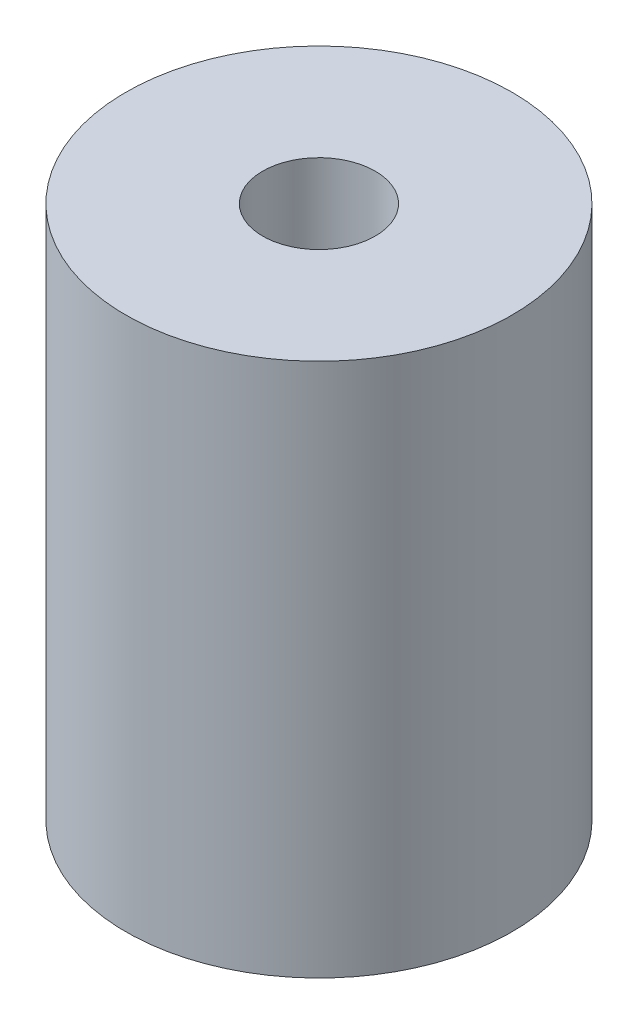
ISO-10303-21;
HEADER;
FILE_DESCRIPTION(('STEP AP214'),'2;1');
FILE_NAME('part.step','',(''),(''),'','','');
FILE_SCHEMA(('AUTOMOTIVE_DESIGN { 1 0 10303 214 1 1 1 1 }'));
ENDSEC;
DATA;
#1=APPLICATION_CONTEXT('core data for automotive mechanical design processes');
#2=APPLICATION_PROTOCOL_DEFINITION('international standard','automotive_design',2000,#1);
#3=PRODUCT_CONTEXT('',#1,'mechanical');
#4=PRODUCT('Part','Part','',(#3));
#5=PRODUCT_RELATED_PRODUCT_CATEGORY('part','',(#4));
#6=PRODUCT_DEFINITION_FORMATION('','',#4);
#7=PRODUCT_DEFINITION_CONTEXT('part definition',#1,'design');
#8=PRODUCT_DEFINITION('design','',#6,#7);
#9=PRODUCT_DEFINITION_SHAPE('','',#8);
#10=(LENGTH_UNIT() NAMED_UNIT(*) SI_UNIT(.MILLI.,.METRE.));
#11=(NAMED_UNIT(*) PLANE_ANGLE_UNIT() SI_UNIT($,.RADIAN.));
#12=(NAMED_UNIT(*) SI_UNIT($,.STERADIAN.) SOLID_ANGLE_UNIT());
#13=UNCERTAINTY_MEASURE_WITH_UNIT(LENGTH_MEASURE(1.E-05),#10,'distance_accuracy_value','');
#14=(GEOMETRIC_REPRESENTATION_CONTEXT(3) GLOBAL_UNCERTAINTY_ASSIGNED_CONTEXT((#13)) GLOBAL_UNIT_ASSIGNED_CONTEXT((#10,
#11,#12)) REPRESENTATION_CONTEXT('',''));
#15=CARTESIAN_POINT('',(0.,0.,0.));
#16=DIRECTION('',(0.,0.,1.));
#17=DIRECTION('',(1.,0.,0.));
#18=AXIS2_PLACEMENT_3D('',#15,#16,#17);
#19=CARTESIAN_POINT('',(0.,8.3,0.));
#20=DIRECTION('',(0.,1.,0.));
#21=DIRECTION('',(0.,0.,1.));
#22=AXIS2_PLACEMENT_3D('',#19,#20,#21);
#23=PLANE('',#22);
#24=CARTESIAN_POINT('',(0.,8.3,0.));
#25=DIRECTION('',(0.,1.,0.));
#26=DIRECTION('',(0.,0.,1.));
#27=AXIS2_PLACEMENT_3D('',#24,#25,#26);
#28=CIRCLE('',#27,6.);
#29=CARTESIAN_POINT('',(0.,8.3,-6.));
#30=VERTEX_POINT('',#29);
#31=EDGE_CURVE('E10',#30,#30,#28,.T.);
#32=ORIENTED_EDGE('',*,*,#31,.T.);
#33=EDGE_LOOP('',(#32));
#34=FACE_BOUND('',#33,.T.);
#35=CARTESIAN_POINT('',(0.,8.3,0.));
#36=DIRECTION('',(0.,1.,0.));
#37=DIRECTION('',(0.,0.,1.));
#38=AXIS2_PLACEMENT_3D('',#35,#36,#37);
#39=CIRCLE('',#38,1.75);
#40=CARTESIAN_POINT('',(0.,8.3,-1.75));
#41=VERTEX_POINT('',#40);
#42=EDGE_CURVE('E56',#41,#41,#39,.T.);
#43=ORIENTED_EDGE('',*,*,#42,.F.);
#44=EDGE_LOOP('',(#43));
#45=FACE_BOUND('',#44,.T.);
#46=ADVANCED_FACE('F45',(#34,#45),#23,.T.);
#47=CARTESIAN_POINT('',(0.,-8.3,0.));
#48=DIRECTION('',(0.,1.,0.));
#49=DIRECTION('',(0.,0.,1.));
#50=AXIS2_PLACEMENT_3D('',#47,#48,#49);
#51=PLANE('',#50);
#52=CARTESIAN_POINT('',(0.,-8.3,0.));
#53=DIRECTION('',(0.,1.,0.));
#54=DIRECTION('',(0.,0.,1.));
#55=AXIS2_PLACEMENT_3D('',#52,#53,#54);
#56=CIRCLE('',#55,6.);
#57=CARTESIAN_POINT('',(0.,-8.3,-6.));
#58=VERTEX_POINT('',#57);
#59=EDGE_CURVE('E49',#58,#58,#56,.T.);
#60=ORIENTED_EDGE('',*,*,#59,.F.);
#61=EDGE_LOOP('',(#60));
#62=FACE_BOUND('',#61,.T.);
#63=CARTESIAN_POINT('',(0.,-8.3,0.));
#64=DIRECTION('',(0.,1.,0.));
#65=DIRECTION('',(0.,0.,1.));
#66=AXIS2_PLACEMENT_3D('',#63,#64,#65);
#67=CIRCLE('',#66,1.75);
#68=CARTESIAN_POINT('',(0.,-8.3,-1.75));
#69=VERTEX_POINT('',#68);
#70=EDGE_CURVE('E58',#69,#69,#67,.T.);
#71=ORIENTED_EDGE('',*,*,#70,.T.);
#72=EDGE_LOOP('',(#71));
#73=FACE_BOUND('',#72,.T.);
#74=ADVANCED_FACE('F68',(#62,#73),#51,.F.);
#75=CARTESIAN_POINT('',(0.,8.3,0.));
#76=DIRECTION('',(0.,-1.,0.));
#77=DIRECTION('',(0.,0.,-1.));
#78=AXIS2_PLACEMENT_3D('',#75,#76,#77);
#79=CYLINDRICAL_SURFACE('',#78,6.);
#80=CARTESIAN_POINT('',(0.,8.3,-6.));
#81=CARTESIAN_POINT('',(0.,8.12708333333333,-6.));
#82=CARTESIAN_POINT('',(0.,7.95416666666667,-6.));
#83=CARTESIAN_POINT('',(0.,7.60833333333333,-6.));
#84=CARTESIAN_POINT('',(0.,7.43541666666667,-6.));
#85=CARTESIAN_POINT('',(0.,7.08958333333333,-6.));
#86=CARTESIAN_POINT('',(0.,6.91666666666667,-6.));
#87=CARTESIAN_POINT('',(0.,6.57083333333333,-6.));
#88=CARTESIAN_POINT('',(0.,6.39791666666667,-6.));
#89=CARTESIAN_POINT('',(0.,6.05208333333333,-6.));
#90=CARTESIAN_POINT('',(0.,5.87916666666667,-6.));
#91=CARTESIAN_POINT('',(0.,5.53333333333333,-6.));
#92=CARTESIAN_POINT('',(0.,5.36041666666667,-6.));
#93=CARTESIAN_POINT('',(0.,5.01458333333333,-6.));
#94=CARTESIAN_POINT('',(0.,4.84166666666667,-6.));
#95=CARTESIAN_POINT('',(0.,4.49583333333333,-6.));
#96=CARTESIAN_POINT('',(0.,4.32291666666667,-6.));
#97=CARTESIAN_POINT('',(0.,3.97708333333333,-6.));
#98=CARTESIAN_POINT('',(0.,3.80416666666667,-6.));
#99=CARTESIAN_POINT('',(0.,3.45833333333333,-6.));
#100=CARTESIAN_POINT('',(0.,3.28541666666667,-6.));
#101=CARTESIAN_POINT('',(0.,2.93958333333333,-6.));
#102=CARTESIAN_POINT('',(0.,2.76666666666667,-6.));
#103=CARTESIAN_POINT('',(0.,2.42083333333333,-6.));
#104=CARTESIAN_POINT('',(0.,2.24791666666667,-6.));
#105=CARTESIAN_POINT('',(0.,1.90208333333333,-6.));
#106=CARTESIAN_POINT('',(0.,1.72916666666667,-6.));
#107=CARTESIAN_POINT('',(0.,1.38333333333333,-6.));
#108=CARTESIAN_POINT('',(0.,1.21041666666667,-6.));
#109=CARTESIAN_POINT('',(0.,0.864583333333332,-6.));
#110=CARTESIAN_POINT('',(0.,0.691666666666665,-6.));
#111=CARTESIAN_POINT('',(0.,0.345833333333332,-6.));
#112=CARTESIAN_POINT('',(0.,0.172916666666666,-6.));
#113=CARTESIAN_POINT('',(0.,-0.172916666666667,-6.));
#114=CARTESIAN_POINT('',(0.,-0.345833333333333,-6.));
#115=CARTESIAN_POINT('',(0.,-0.691666666666667,-6.));
#116=CARTESIAN_POINT('',(0.,-0.864583333333333,-6.));
#117=CARTESIAN_POINT('',(0.,-1.21041666666667,-6.));
#118=CARTESIAN_POINT('',(0.,-1.38333333333333,-6.));
#119=CARTESIAN_POINT('',(0.,-1.72916666666667,-6.));
#120=CARTESIAN_POINT('',(0.,-1.90208333333333,-6.));
#121=CARTESIAN_POINT('',(0.,-2.24791666666667,-6.));
#122=CARTESIAN_POINT('',(0.,-2.42083333333333,-6.));
#123=CARTESIAN_POINT('',(0.,-2.76666666666667,-6.));
#124=CARTESIAN_POINT('',(0.,-2.93958333333333,-6.));
#125=CARTESIAN_POINT('',(0.,-3.28541666666667,-6.));
#126=CARTESIAN_POINT('',(0.,-3.45833333333333,-6.));
#127=CARTESIAN_POINT('',(0.,-3.80416666666667,-6.));
#128=CARTESIAN_POINT('',(0.,-3.97708333333333,-6.));
#129=CARTESIAN_POINT('',(0.,-4.32291666666667,-6.));
#130=CARTESIAN_POINT('',(0.,-4.49583333333333,-6.));
#131=CARTESIAN_POINT('',(0.,-4.84166666666667,-6.));
#132=CARTESIAN_POINT('',(0.,-5.01458333333333,-6.));
#133=CARTESIAN_POINT('',(0.,-5.36041666666667,-6.));
#134=CARTESIAN_POINT('',(0.,-5.53333333333333,-6.));
#135=CARTESIAN_POINT('',(0.,-5.87916666666667,-6.));
#136=CARTESIAN_POINT('',(0.,-6.05208333333333,-6.));
#137=CARTESIAN_POINT('',(0.,-6.39791666666667,-6.));
#138=CARTESIAN_POINT('',(0.,-6.57083333333333,-6.));
#139=CARTESIAN_POINT('',(0.,-6.91666666666667,-6.));
#140=CARTESIAN_POINT('',(0.,-7.08958333333333,-6.));
#141=CARTESIAN_POINT('',(0.,-7.43541666666667,-6.));
#142=CARTESIAN_POINT('',(0.,-7.60833333333334,-6.));
#143=CARTESIAN_POINT('',(0.,-7.95416666666667,-6.));
#144=CARTESIAN_POINT('',(0.,-8.12708333333333,-6.));
#145=CARTESIAN_POINT('',(0.,-8.3,-6.));
#146=B_SPLINE_CURVE_WITH_KNOTS('',3,(#80,#81,#82,#83,#84,#85,#86,#87,#88,#89,#90,#91,#92,#93,
#94,#95,#96,#97,#98,#99,#100,#101,#102,#103,#104,#105,#106,#107,#108,#109,#110,#111,#112,#113,
#114,#115,#116,#117,#118,#119,#120,#121,#122,#123,#124,#125,#126,#127,#128,#129,#130,#131,#132,
#133,#134,#135,#136,#137,#138,#139,#140,#141,#142,#143,#144,#145),.UNSPECIFIED.,.F.,.F.,(4,2,2,
2,2,2,2,2,2,2,2,2,2,2,2,2,2,2,2,2,2,2,2,2,2,2,2,2,2,2,2,2,4),(0.,0.518750000000001,1.0375,
1.55625,2.075,2.59375,3.1125,3.63125,4.15,4.66875,5.1875,5.70625,6.225,6.74375,7.2625,7.78125,
8.3,8.81875,9.3375,9.85625,10.375,10.89375,11.4125,11.93125,12.45,12.96875,13.4875,14.00625,
14.525,15.04375,15.5625,16.08125,16.6),.UNSPECIFIED.);
#147=EDGE_CURVE('BSEAM47',#30,#58,#146,.T.);
#148=ORIENTED_EDGE('',*,*,#31,.F.);
#149=ORIENTED_EDGE('',*,*,#59,.T.);
#150=ORIENTED_EDGE('',*,*,#147,.T.);
#151=ORIENTED_EDGE('',*,*,#147,.F.);
#152=EDGE_LOOP('',(#148,#150,#149,#151));
#153=FACE_BOUND('',#152,.T.);
#154=ADVANCED_FACE('F47',(#153),#79,.T.);
#155=CARTESIAN_POINT('',(0.,8.3,0.));
#156=DIRECTION('',(0.,-1.,0.));
#157=DIRECTION('',(0.,0.,-1.));
#158=AXIS2_PLACEMENT_3D('',#155,#156,#157);
#159=CYLINDRICAL_SURFACE('',#158,1.75);
#160=CARTESIAN_POINT('',(0.,8.3,-1.75));
#161=CARTESIAN_POINT('',(0.,8.12708333333333,-1.75));
#162=CARTESIAN_POINT('',(0.,7.95416666666666,-1.75));
#163=CARTESIAN_POINT('',(0.,7.60833333333333,-1.75));
#164=CARTESIAN_POINT('',(0.,7.43541666666667,-1.75));
#165=CARTESIAN_POINT('',(0.,7.08958333333333,-1.75));
#166=CARTESIAN_POINT('',(0.,6.91666666666667,-1.75));
#167=CARTESIAN_POINT('',(0.,6.57083333333333,-1.75));
#168=CARTESIAN_POINT('',(0.,6.39791666666667,-1.75));
#169=CARTESIAN_POINT('',(0.,6.05208333333333,-1.75));
#170=CARTESIAN_POINT('',(0.,5.87916666666667,-1.75));
#171=CARTESIAN_POINT('',(0.,5.53333333333333,-1.75));
#172=CARTESIAN_POINT('',(0.,5.36041666666667,-1.75));
#173=CARTESIAN_POINT('',(0.,5.01458333333333,-1.75));
#174=CARTESIAN_POINT('',(0.,4.84166666666667,-1.75));
#175=CARTESIAN_POINT('',(0.,4.49583333333333,-1.75));
#176=CARTESIAN_POINT('',(0.,4.32291666666667,-1.75));
#177=CARTESIAN_POINT('',(0.,3.97708333333333,-1.75));
#178=CARTESIAN_POINT('',(0.,3.80416666666667,-1.75));
#179=CARTESIAN_POINT('',(0.,3.45833333333333,-1.75));
#180=CARTESIAN_POINT('',(0.,3.28541666666667,-1.75));
#181=CARTESIAN_POINT('',(0.,2.93958333333333,-1.75));
#182=CARTESIAN_POINT('',(0.,2.76666666666667,-1.75));
#183=CARTESIAN_POINT('',(0.,2.42083333333333,-1.75));
#184=CARTESIAN_POINT('',(0.,2.24791666666667,-1.75));
#185=CARTESIAN_POINT('',(0.,1.90208333333333,-1.75));
#186=CARTESIAN_POINT('',(0.,1.72916666666667,-1.75));
#187=CARTESIAN_POINT('',(0.,1.38333333333333,-1.75));
#188=CARTESIAN_POINT('',(0.,1.21041666666667,-1.75));
#189=CARTESIAN_POINT('',(0.,0.864583333333332,-1.75));
#190=CARTESIAN_POINT('',(0.,0.691666666666665,-1.75));
#191=CARTESIAN_POINT('',(0.,0.345833333333332,-1.75));
#192=CARTESIAN_POINT('',(0.,0.172916666666665,-1.75));
#193=CARTESIAN_POINT('',(0.,-0.172916666666668,-1.75));
#194=CARTESIAN_POINT('',(0.,-0.345833333333335,-1.75));
#195=CARTESIAN_POINT('',(0.,-0.691666666666669,-1.75));
#196=CARTESIAN_POINT('',(0.,-0.864583333333335,-1.75));
#197=CARTESIAN_POINT('',(0.,-1.21041666666667,-1.75));
#198=CARTESIAN_POINT('',(0.,-1.38333333333334,-1.75));
#199=CARTESIAN_POINT('',(0.,-1.72916666666667,-1.75));
#200=CARTESIAN_POINT('',(0.,-1.90208333333334,-1.75));
#201=CARTESIAN_POINT('',(0.,-2.24791666666667,-1.75));
#202=CARTESIAN_POINT('',(0.,-2.42083333333334,-1.75));
#203=CARTESIAN_POINT('',(0.,-2.76666666666667,-1.75));
#204=CARTESIAN_POINT('',(0.,-2.93958333333334,-1.75));
#205=CARTESIAN_POINT('',(0.,-3.28541666666667,-1.75));
#206=CARTESIAN_POINT('',(0.,-3.45833333333334,-1.75));
#207=CARTESIAN_POINT('',(0.,-3.80416666666667,-1.75));
#208=CARTESIAN_POINT('',(0.,-3.97708333333334,-1.75));
#209=CARTESIAN_POINT('',(0.,-4.32291666666667,-1.75));
#210=CARTESIAN_POINT('',(0.,-4.49583333333334,-1.75));
#211=CARTESIAN_POINT('',(0.,-4.84166666666667,-1.75));
#212=CARTESIAN_POINT('',(0.,-5.01458333333334,-1.75));
#213=CARTESIAN_POINT('',(0.,-5.36041666666667,-1.75));
#214=CARTESIAN_POINT('',(0.,-5.53333333333334,-1.75));
#215=CARTESIAN_POINT('',(0.,-5.87916666666667,-1.75));
#216=CARTESIAN_POINT('',(0.,-6.05208333333334,-1.75));
#217=CARTESIAN_POINT('',(0.,-6.39791666666667,-1.75));
#218=CARTESIAN_POINT('',(0.,-6.57083333333334,-1.75));
#219=CARTESIAN_POINT('',(0.,-6.91666666666667,-1.75));
#220=CARTESIAN_POINT('',(0.,-7.08958333333334,-1.75));
#221=CARTESIAN_POINT('',(0.,-7.43541666666667,-1.75));
#222=CARTESIAN_POINT('',(0.,-7.60833333333334,-1.75));
#223=CARTESIAN_POINT('',(0.,-7.95416666666667,-1.75));
#224=CARTESIAN_POINT('',(0.,-8.12708333333333,-1.75));
#225=CARTESIAN_POINT('',(0.,-8.3,-1.75));
#226=B_SPLINE_CURVE_WITH_KNOTS('',3,(#160,#161,#162,#163,#164,#165,#166,#167,#168,#169,#170,
#171,#172,#173,#174,#175,#176,#177,#178,#179,#180,#181,#182,#183,#184,#185,#186,#187,#188,#189,
#190,#191,#192,#193,#194,#195,#196,#197,#198,#199,#200,#201,#202,#203,#204,#205,#206,#207,#208,
#209,#210,#211,#212,#213,#214,#215,#216,#217,#218,#219,#220,#221,#222,#223,#224,#225),
.UNSPECIFIED.,.F.,.F.,(4,2,2,2,2,2,2,2,2,2,2,2,2,2,2,2,2,2,2,2,2,2,2,2,2,2,2,2,2,2,2,2,4),(0.,
0.518749999999999,1.0375,1.55625,2.075,2.59375,3.1125,3.63125,4.15,4.66875,5.1875,5.70625,6.225,
6.74375,7.2625,7.78125,8.3,8.81875,9.3375,9.85625,10.375,10.89375,11.4125,11.93125,12.45,
12.96875,13.4875,14.00625,14.525,15.04375,15.5625,16.08125,16.6),.UNSPECIFIED.);
#227=EDGE_CURVE('BSEAM64',#41,#69,#226,.T.);
#228=ORIENTED_EDGE('',*,*,#42,.T.);
#229=ORIENTED_EDGE('',*,*,#70,.F.);
#230=ORIENTED_EDGE('',*,*,#227,.T.);
#231=ORIENTED_EDGE('',*,*,#227,.F.);
#232=EDGE_LOOP('',(#228,#230,#229,#231));
#233=FACE_BOUND('',#232,.T.);
#234=ADVANCED_FACE('F64',(#233),#159,.F.);
#235=CLOSED_SHELL('',(#46,#74,#154,#234));
#236=MANIFOLD_SOLID_BREP('B2',#235);
#237=ADVANCED_BREP_SHAPE_REPRESENTATION('',(#18,#236),#14);
#238=SHAPE_DEFINITION_REPRESENTATION(#9,#237);
ENDSEC;
END-ISO-10303-21;
